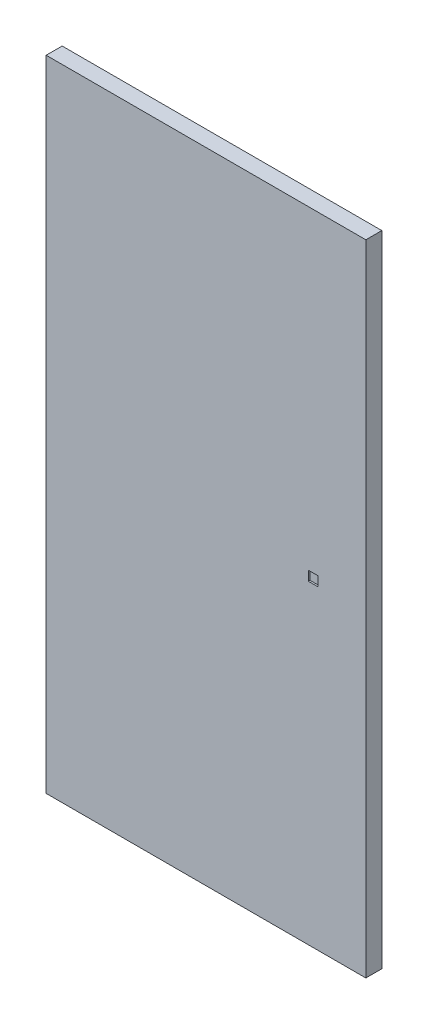
ISO-10303-21;
HEADER;
FILE_DESCRIPTION(('STEP AP214'),'2;1');
FILE_NAME('part.step','',(''),(''),'','','');
FILE_SCHEMA(('AUTOMOTIVE_DESIGN { 1 0 10303 214 1 1 1 1 }'));
ENDSEC;
DATA;
#1=APPLICATION_CONTEXT('core data for automotive mechanical design processes');
#2=APPLICATION_PROTOCOL_DEFINITION('international standard','automotive_design',2000,#1);
#3=PRODUCT_CONTEXT('',#1,'mechanical');
#4=PRODUCT('Part','Part','',(#3));
#5=PRODUCT_RELATED_PRODUCT_CATEGORY('part','',(#4));
#6=PRODUCT_DEFINITION_FORMATION('','',#4);
#7=PRODUCT_DEFINITION_CONTEXT('part definition',#1,'design');
#8=PRODUCT_DEFINITION('design','',#6,#7);
#9=PRODUCT_DEFINITION_SHAPE('','',#8);
#10=(LENGTH_UNIT() NAMED_UNIT(*) SI_UNIT(.MILLI.,.METRE.));
#11=(NAMED_UNIT(*) PLANE_ANGLE_UNIT() SI_UNIT($,.RADIAN.));
#12=(NAMED_UNIT(*) SI_UNIT($,.STERADIAN.) SOLID_ANGLE_UNIT());
#13=UNCERTAINTY_MEASURE_WITH_UNIT(LENGTH_MEASURE(1.E-05),#10,'distance_accuracy_value','');
#14=(GEOMETRIC_REPRESENTATION_CONTEXT(3) GLOBAL_UNCERTAINTY_ASSIGNED_CONTEXT((#13)) GLOBAL_UNIT_ASSIGNED_CONTEXT((#10,
#11,#12)) REPRESENTATION_CONTEXT('',''));
#15=CARTESIAN_POINT('',(0.,0.,0.));
#16=DIRECTION('',(0.,0.,1.));
#17=DIRECTION('',(1.,0.,0.));
#18=AXIS2_PLACEMENT_3D('',#15,#16,#17);
#19=CARTESIAN_POINT('',(0.,0.,0.));
#20=DIRECTION('',(0.,0.,1.));
#21=DIRECTION('',(1.,0.,0.));
#22=AXIS2_PLACEMENT_3D('',#19,#20,#21);
#23=PLANE('',#22);
#24=DIRECTION('',(0.,-1.,0.));
#25=VECTOR('',#24,1.);
#26=CARTESIAN_POINT('',(-500.,-1000.,0.));
#27=LINE('',#26,#25);
#28=CARTESIAN_POINT('',(-500.,1000.,0.));
#29=VERTEX_POINT('',#28);
#30=CARTESIAN_POINT('',(-500.,-1000.,0.));
#31=VERTEX_POINT('',#30);
#32=EDGE_CURVE('E184',#29,#31,#27,.T.);
#33=ORIENTED_EDGE('',*,*,#32,.F.);
#34=DIRECTION('',(-1.,0.,0.));
#35=VECTOR('',#34,1.);
#36=CARTESIAN_POINT('',(500.,1000.,0.));
#37=LINE('',#36,#35);
#38=CARTESIAN_POINT('',(500.,1000.,0.));
#39=VERTEX_POINT('',#38);
#40=EDGE_CURVE('E194',#39,#29,#37,.T.);
#41=ORIENTED_EDGE('',*,*,#40,.F.);
#42=DIRECTION('',(0.,1.,0.));
#43=VECTOR('',#42,1.);
#44=CARTESIAN_POINT('',(500.,-1000.,0.));
#45=LINE('',#44,#43);
#46=CARTESIAN_POINT('',(500.,-1000.,0.));
#47=VERTEX_POINT('',#46);
#48=EDGE_CURVE('E205',#47,#39,#45,.T.);
#49=ORIENTED_EDGE('',*,*,#48,.F.);
#50=DIRECTION('',(1.,0.,0.));
#51=VECTOR('',#50,1.);
#52=CARTESIAN_POINT('',(500.,-1000.,0.));
#53=LINE('',#52,#51);
#54=EDGE_CURVE('E203',#31,#47,#53,.T.);
#55=ORIENTED_EDGE('',*,*,#54,.F.);
#56=EDGE_LOOP('',(#33,#41,#49,#55));
#57=FACE_BOUND('',#56,.T.);
#58=DIRECTION('',(0.,-1.,0.));
#59=VECTOR('',#58,1.);
#60=CARTESIAN_POINT('',(320.,0.,0.));
#61=LINE('',#60,#59);
#62=CARTESIAN_POINT('',(320.,15.,0.));
#63=VERTEX_POINT('',#62);
#64=CARTESIAN_POINT('',(320.,-15.,0.));
#65=VERTEX_POINT('',#64);
#66=EDGE_CURVE('E48',#63,#65,#61,.T.);
#67=ORIENTED_EDGE('',*,*,#66,.T.);
#68=DIRECTION('',(-1.,0.,0.));
#69=VECTOR('',#68,1.);
#70=CARTESIAN_POINT('',(0.,-15.,0.));
#71=LINE('',#70,#69);
#72=CARTESIAN_POINT('',(350.,-15.,0.));
#73=VERTEX_POINT('',#72);
#74=EDGE_CURVE('E142',#73,#65,#71,.T.);
#75=ORIENTED_EDGE('',*,*,#74,.F.);
#76=DIRECTION('',(0.,-1.,0.));
#77=VECTOR('',#76,1.);
#78=CARTESIAN_POINT('',(350.,0.,0.));
#79=LINE('',#78,#77);
#80=CARTESIAN_POINT('',(350.,15.,0.));
#81=VERTEX_POINT('',#80);
#82=EDGE_CURVE('E145',#81,#73,#79,.T.);
#83=ORIENTED_EDGE('',*,*,#82,.F.);
#84=DIRECTION('',(-1.,0.,0.));
#85=VECTOR('',#84,1.);
#86=CARTESIAN_POINT('',(0.,15.,0.));
#87=LINE('',#86,#85);
#88=EDGE_CURVE('E151',#81,#63,#87,.T.);
#89=ORIENTED_EDGE('',*,*,#88,.T.);
#90=EDGE_LOOP('',(#67,#75,#83,#89));
#91=FACE_BOUND('',#90,.T.);
#92=ADVANCED_FACE('F33',(#57,#91),#23,.F.);
#93=CARTESIAN_POINT('',(-500.,-1000.,50.));
#94=DIRECTION('',(1.,0.,0.));
#95=DIRECTION('',(0.,0.,-1.));
#96=AXIS2_PLACEMENT_3D('',#93,#94,#95);
#97=PLANE('',#96);
#98=ORIENTED_EDGE('',*,*,#32,.T.);
#99=DIRECTION('',(0.,0.,-1.));
#100=VECTOR('',#99,1.);
#101=CARTESIAN_POINT('',(-500.,-1000.,50.));
#102=LINE('',#101,#100);
#103=CARTESIAN_POINT('',(-500.,-1000.,50.));
#104=VERTEX_POINT('',#103);
#105=EDGE_CURVE('E11',#104,#31,#102,.T.);
#106=ORIENTED_EDGE('',*,*,#105,.F.);
#107=DIRECTION('',(0.,-1.,0.));
#108=VECTOR('',#107,1.);
#109=CARTESIAN_POINT('',(-500.,-1000.,50.));
#110=LINE('',#109,#108);
#111=CARTESIAN_POINT('',(-500.,1000.,50.));
#112=VERTEX_POINT('',#111);
#113=EDGE_CURVE('E190',#112,#104,#110,.T.);
#114=ORIENTED_EDGE('',*,*,#113,.F.);
#115=DIRECTION('',(0.,0.,-1.));
#116=VECTOR('',#115,1.);
#117=CARTESIAN_POINT('',(-500.,1000.,50.));
#118=LINE('',#117,#116);
#119=EDGE_CURVE('E200',#112,#29,#118,.T.);
#120=ORIENTED_EDGE('',*,*,#119,.T.);
#121=EDGE_LOOP('',(#98,#106,#114,#120));
#122=FACE_BOUND('',#121,.T.);
#123=ADVANCED_FACE('F35',(#122),#97,.F.);
#124=CARTESIAN_POINT('',(500.,-1000.,50.));
#125=DIRECTION('',(0.,1.,0.));
#126=DIRECTION('',(-1.,0.,0.));
#127=AXIS2_PLACEMENT_3D('',#124,#125,#126);
#128=PLANE('',#127);
#129=ORIENTED_EDGE('',*,*,#54,.T.);
#130=DIRECTION('',(0.,0.,-1.));
#131=VECTOR('',#130,1.);
#132=CARTESIAN_POINT('',(500.,-1000.,50.));
#133=LINE('',#132,#131);
#134=CARTESIAN_POINT('',(500.,-1000.,50.));
#135=VERTEX_POINT('',#134);
#136=EDGE_CURVE('E41',#135,#47,#133,.T.);
#137=ORIENTED_EDGE('',*,*,#136,.F.);
#138=DIRECTION('',(1.,0.,0.));
#139=VECTOR('',#138,1.);
#140=CARTESIAN_POINT('',(500.,-1000.,50.));
#141=LINE('',#140,#139);
#142=EDGE_CURVE('E193',#104,#135,#141,.T.);
#143=ORIENTED_EDGE('',*,*,#142,.F.);
#144=ORIENTED_EDGE('',*,*,#105,.T.);
#145=EDGE_LOOP('',(#129,#137,#143,#144));
#146=FACE_BOUND('',#145,.T.);
#147=ADVANCED_FACE('F233',(#146),#128,.F.);
#148=CARTESIAN_POINT('',(500.,-1000.,50.));
#149=DIRECTION('',(-1.,0.,0.));
#150=DIRECTION('',(0.,0.,1.));
#151=AXIS2_PLACEMENT_3D('',#148,#149,#150);
#152=PLANE('',#151);
#153=ORIENTED_EDGE('',*,*,#48,.T.);
#154=DIRECTION('',(0.,0.,-1.));
#155=VECTOR('',#154,1.);
#156=CARTESIAN_POINT('',(500.,1000.,50.));
#157=LINE('',#156,#155);
#158=CARTESIAN_POINT('',(500.,1000.,50.));
#159=VERTEX_POINT('',#158);
#160=EDGE_CURVE('E210',#159,#39,#157,.T.);
#161=ORIENTED_EDGE('',*,*,#160,.F.);
#162=DIRECTION('',(0.,1.,0.));
#163=VECTOR('',#162,1.);
#164=CARTESIAN_POINT('',(500.,-1000.,50.));
#165=LINE('',#164,#163);
#166=EDGE_CURVE('E196',#135,#159,#165,.T.);
#167=ORIENTED_EDGE('',*,*,#166,.F.);
#168=ORIENTED_EDGE('',*,*,#136,.T.);
#169=EDGE_LOOP('',(#153,#161,#167,#168));
#170=FACE_BOUND('',#169,.T.);
#171=ADVANCED_FACE('F217',(#170),#152,.F.);
#172=CARTESIAN_POINT('',(500.,1000.,50.));
#173=DIRECTION('',(0.,-1.,0.));
#174=DIRECTION('',(1.,0.,0.));
#175=AXIS2_PLACEMENT_3D('',#172,#173,#174);
#176=PLANE('',#175);
#177=ORIENTED_EDGE('',*,*,#40,.T.);
#178=ORIENTED_EDGE('',*,*,#119,.F.);
#179=DIRECTION('',(-1.,0.,0.));
#180=VECTOR('',#179,1.);
#181=CARTESIAN_POINT('',(500.,1000.,50.));
#182=LINE('',#181,#180);
#183=EDGE_CURVE('E198',#159,#112,#182,.T.);
#184=ORIENTED_EDGE('',*,*,#183,.F.);
#185=ORIENTED_EDGE('',*,*,#160,.T.);
#186=EDGE_LOOP('',(#177,#178,#184,#185));
#187=FACE_BOUND('',#186,.T.);
#188=ADVANCED_FACE('F226',(#187),#176,.F.);
#189=CARTESIAN_POINT('',(0.,0.,50.));
#190=DIRECTION('',(0.,0.,1.));
#191=DIRECTION('',(1.,0.,0.));
#192=AXIS2_PLACEMENT_3D('',#189,#190,#191);
#193=PLANE('',#192);
#194=DIRECTION('',(-1.,0.,0.));
#195=VECTOR('',#194,1.);
#196=CARTESIAN_POINT('',(0.,14.9999999999999,50.));
#197=LINE('',#196,#195);
#198=CARTESIAN_POINT('',(350.,15.,50.));
#199=VERTEX_POINT('',#198);
#200=CARTESIAN_POINT('',(320.,15.,50.));
#201=VERTEX_POINT('',#200);
#202=EDGE_CURVE('E56',#199,#201,#197,.T.);
#203=ORIENTED_EDGE('',*,*,#202,.F.);
#204=DIRECTION('',(0.,-1.,0.));
#205=VECTOR('',#204,1.);
#206=CARTESIAN_POINT('',(350.,0.,50.));
#207=LINE('',#206,#205);
#208=CARTESIAN_POINT('',(350.,-15.,50.));
#209=VERTEX_POINT('',#208);
#210=EDGE_CURVE('E164',#199,#209,#207,.T.);
#211=ORIENTED_EDGE('',*,*,#210,.T.);
#212=DIRECTION('',(1.,0.,0.));
#213=VECTOR('',#212,1.);
#214=CARTESIAN_POINT('',(0.,-14.9999999999999,50.));
#215=LINE('',#214,#213);
#216=CARTESIAN_POINT('',(320.,-15.,50.));
#217=VERTEX_POINT('',#216);
#218=EDGE_CURVE('E177',#217,#209,#215,.T.);
#219=ORIENTED_EDGE('',*,*,#218,.F.);
#220=DIRECTION('',(0.,-1.,0.));
#221=VECTOR('',#220,1.);
#222=CARTESIAN_POINT('',(320.,0.,50.));
#223=LINE('',#222,#221);
#224=EDGE_CURVE('E174',#201,#217,#223,.T.);
#225=ORIENTED_EDGE('',*,*,#224,.F.);
#226=EDGE_LOOP('',(#203,#211,#219,#225));
#227=FACE_BOUND('',#226,.T.);
#228=ORIENTED_EDGE('',*,*,#113,.T.);
#229=ORIENTED_EDGE('',*,*,#142,.T.);
#230=ORIENTED_EDGE('',*,*,#166,.T.);
#231=ORIENTED_EDGE('',*,*,#183,.T.);
#232=EDGE_LOOP('',(#228,#229,#230,#231));
#233=FACE_BOUND('',#232,.T.);
#234=ADVANCED_FACE('F232',(#227,#233),#193,.T.);
#235=CARTESIAN_POINT('',(0.,14.9999999999999,45.));
#236=DIRECTION('',(0.,1.,0.));
#237=DIRECTION('',(-1.,0.,0.));
#238=AXIS2_PLACEMENT_3D('',#235,#236,#237);
#239=PLANE('',#238);
#240=ORIENTED_EDGE('',*,*,#202,.T.);
#241=DIRECTION('',(0.,0.,1.));
#242=VECTOR('',#241,1.);
#243=CARTESIAN_POINT('',(320.,15.,45.));
#244=LINE('',#243,#242);
#245=CARTESIAN_POINT('',(320.,15.,45.));
#246=VERTEX_POINT('',#245);
#247=EDGE_CURVE('E172',#246,#201,#244,.T.);
#248=ORIENTED_EDGE('',*,*,#247,.F.);
#249=DIRECTION('',(-1.,0.,0.));
#250=VECTOR('',#249,1.);
#251=CARTESIAN_POINT('',(0.,14.9999999999999,45.));
#252=LINE('',#251,#250);
#253=CARTESIAN_POINT('',(350.,15.,45.));
#254=VERTEX_POINT('',#253);
#255=EDGE_CURVE('E160',#254,#246,#252,.T.);
#256=ORIENTED_EDGE('',*,*,#255,.F.);
#257=DIRECTION('',(0.,0.,1.));
#258=VECTOR('',#257,1.);
#259=CARTESIAN_POINT('',(350.,15.,45.));
#260=LINE('',#259,#258);
#261=EDGE_CURVE('E182',#254,#199,#260,.T.);
#262=ORIENTED_EDGE('',*,*,#261,.T.);
#263=EDGE_LOOP('',(#240,#248,#256,#262));
#264=FACE_BOUND('',#263,.T.);
#265=ADVANCED_FACE('F251',(#264),#239,.F.);
#266=CARTESIAN_POINT('',(350.,0.,45.));
#267=DIRECTION('',(-1.,0.,0.));
#268=DIRECTION('',(0.,0.,1.));
#269=AXIS2_PLACEMENT_3D('',#266,#267,#268);
#270=PLANE('',#269);
#271=ORIENTED_EDGE('',*,*,#210,.F.);
#272=ORIENTED_EDGE('',*,*,#261,.F.);
#273=DIRECTION('',(0.,-1.,0.));
#274=VECTOR('',#273,1.);
#275=CARTESIAN_POINT('',(350.,0.,45.));
#276=LINE('',#275,#274);
#277=CARTESIAN_POINT('',(350.,-15.,45.));
#278=VERTEX_POINT('',#277);
#279=EDGE_CURVE('E170',#254,#278,#276,.T.);
#280=ORIENTED_EDGE('',*,*,#279,.T.);
#281=DIRECTION('',(0.,0.,1.));
#282=VECTOR('',#281,1.);
#283=CARTESIAN_POINT('',(350.,-15.,45.));
#284=LINE('',#283,#282);
#285=EDGE_CURVE('E185',#278,#209,#284,.T.);
#286=ORIENTED_EDGE('',*,*,#285,.T.);
#287=EDGE_LOOP('',(#271,#272,#280,#286));
#288=FACE_BOUND('',#287,.T.);
#289=ADVANCED_FACE('F256',(#288),#270,.T.);
#290=CARTESIAN_POINT('',(0.,-14.9999999999999,45.));
#291=DIRECTION('',(0.,-1.,0.));
#292=DIRECTION('',(1.,0.,0.));
#293=AXIS2_PLACEMENT_3D('',#290,#291,#292);
#294=PLANE('',#293);
#295=ORIENTED_EDGE('',*,*,#218,.T.);
#296=ORIENTED_EDGE('',*,*,#285,.F.);
#297=DIRECTION('',(1.,0.,0.));
#298=VECTOR('',#297,1.);
#299=CARTESIAN_POINT('',(0.,-14.9999999999999,45.));
#300=LINE('',#299,#298);
#301=CARTESIAN_POINT('',(320.,-15.,45.));
#302=VERTEX_POINT('',#301);
#303=EDGE_CURVE('E167',#302,#278,#300,.T.);
#304=ORIENTED_EDGE('',*,*,#303,.F.);
#305=DIRECTION('',(0.,0.,1.));
#306=VECTOR('',#305,1.);
#307=CARTESIAN_POINT('',(320.,-15.,45.));
#308=LINE('',#307,#306);
#309=EDGE_CURVE('E187',#302,#217,#308,.T.);
#310=ORIENTED_EDGE('',*,*,#309,.T.);
#311=EDGE_LOOP('',(#295,#296,#304,#310));
#312=FACE_BOUND('',#311,.T.);
#313=ADVANCED_FACE('F271',(#312),#294,.F.);
#314=CARTESIAN_POINT('',(320.,0.,45.));
#315=DIRECTION('',(-1.,0.,0.));
#316=DIRECTION('',(0.,0.,1.));
#317=AXIS2_PLACEMENT_3D('',#314,#315,#316);
#318=PLANE('',#317);
#319=ORIENTED_EDGE('',*,*,#224,.T.);
#320=ORIENTED_EDGE('',*,*,#309,.F.);
#321=DIRECTION('',(0.,-1.,0.));
#322=VECTOR('',#321,1.);
#323=CARTESIAN_POINT('',(320.,0.,45.));
#324=LINE('',#323,#322);
#325=EDGE_CURVE('E163',#246,#302,#324,.T.);
#326=ORIENTED_EDGE('',*,*,#325,.F.);
#327=ORIENTED_EDGE('',*,*,#247,.T.);
#328=EDGE_LOOP('',(#319,#320,#326,#327));
#329=FACE_BOUND('',#328,.T.);
#330=ADVANCED_FACE('F261',(#329),#318,.F.);
#331=CARTESIAN_POINT('',(0.,0.,45.));
#332=DIRECTION('',(0.,0.,1.));
#333=DIRECTION('',(1.,0.,0.));
#334=AXIS2_PLACEMENT_3D('',#331,#332,#333);
#335=PLANE('',#334);
#336=ORIENTED_EDGE('',*,*,#255,.T.);
#337=ORIENTED_EDGE('',*,*,#325,.T.);
#338=ORIENTED_EDGE('',*,*,#303,.T.);
#339=ORIENTED_EDGE('',*,*,#279,.F.);
#340=EDGE_LOOP('',(#336,#337,#338,#339));
#341=FACE_BOUND('',#340,.T.);
#342=ADVANCED_FACE('F267',(#341),#335,.T.);
#343=CARTESIAN_POINT('',(320.,0.,5.));
#344=DIRECTION('',(1.,0.,0.));
#345=DIRECTION('',(0.,0.,-1.));
#346=AXIS2_PLACEMENT_3D('',#343,#344,#345);
#347=PLANE('',#346);
#348=ORIENTED_EDGE('',*,*,#66,.F.);
#349=DIRECTION('',(0.,0.,-1.));
#350=VECTOR('',#349,1.);
#351=CARTESIAN_POINT('',(320.,15.,5.));
#352=LINE('',#351,#350);
#353=CARTESIAN_POINT('',(320.,15.,5.));
#354=VERTEX_POINT('',#353);
#355=EDGE_CURVE('E125',#354,#63,#352,.T.);
#356=ORIENTED_EDGE('',*,*,#355,.F.);
#357=DIRECTION('',(0.,-1.,0.));
#358=VECTOR('',#357,1.);
#359=CARTESIAN_POINT('',(320.,0.,5.));
#360=LINE('',#359,#358);
#361=CARTESIAN_POINT('',(320.,-15.,5.));
#362=VERTEX_POINT('',#361);
#363=EDGE_CURVE('E133',#354,#362,#360,.T.);
#364=ORIENTED_EDGE('',*,*,#363,.T.);
#365=DIRECTION('',(0.,0.,-1.));
#366=VECTOR('',#365,1.);
#367=CARTESIAN_POINT('',(320.,-15.,5.));
#368=LINE('',#367,#366);
#369=EDGE_CURVE('E155',#362,#65,#368,.T.);
#370=ORIENTED_EDGE('',*,*,#369,.T.);
#371=EDGE_LOOP('',(#348,#356,#364,#370));
#372=FACE_BOUND('',#371,.T.);
#373=ADVANCED_FACE('F135',(#372),#347,.T.);
#374=CARTESIAN_POINT('',(0.,-15.,5.));
#375=DIRECTION('',(0.,-1.,0.));
#376=DIRECTION('',(0.,0.,-1.));
#377=AXIS2_PLACEMENT_3D('',#374,#375,#376);
#378=PLANE('',#377);
#379=ORIENTED_EDGE('',*,*,#74,.T.);
#380=ORIENTED_EDGE('',*,*,#369,.F.);
#381=DIRECTION('',(-1.,0.,0.));
#382=VECTOR('',#381,1.);
#383=CARTESIAN_POINT('',(0.,-15.,5.));
#384=LINE('',#383,#382);
#385=CARTESIAN_POINT('',(350.,-15.,5.));
#386=VERTEX_POINT('',#385);
#387=EDGE_CURVE('E137',#386,#362,#384,.T.);
#388=ORIENTED_EDGE('',*,*,#387,.F.);
#389=DIRECTION('',(0.,0.,-1.));
#390=VECTOR('',#389,1.);
#391=CARTESIAN_POINT('',(350.,-15.,5.));
#392=LINE('',#391,#390);
#393=EDGE_CURVE('E157',#386,#73,#392,.T.);
#394=ORIENTED_EDGE('',*,*,#393,.T.);
#395=EDGE_LOOP('',(#379,#380,#388,#394));
#396=FACE_BOUND('',#395,.T.);
#397=ADVANCED_FACE('F285',(#396),#378,.F.);
#398=CARTESIAN_POINT('',(350.,0.,5.));
#399=DIRECTION('',(1.,0.,0.));
#400=DIRECTION('',(0.,0.,-1.));
#401=AXIS2_PLACEMENT_3D('',#398,#399,#400);
#402=PLANE('',#401);
#403=ORIENTED_EDGE('',*,*,#82,.T.);
#404=ORIENTED_EDGE('',*,*,#393,.F.);
#405=DIRECTION('',(0.,-1.,0.));
#406=VECTOR('',#405,1.);
#407=CARTESIAN_POINT('',(350.,0.,5.));
#408=LINE('',#407,#406);
#409=CARTESIAN_POINT('',(350.,15.,5.));
#410=VERTEX_POINT('',#409);
#411=EDGE_CURVE('E132',#410,#386,#408,.T.);
#412=ORIENTED_EDGE('',*,*,#411,.F.);
#413=DIRECTION('',(0.,0.,-1.));
#414=VECTOR('',#413,1.);
#415=CARTESIAN_POINT('',(350.,15.,5.));
#416=LINE('',#415,#414);
#417=EDGE_CURVE('E127',#410,#81,#416,.T.);
#418=ORIENTED_EDGE('',*,*,#417,.T.);
#419=EDGE_LOOP('',(#403,#404,#412,#418));
#420=FACE_BOUND('',#419,.T.);
#421=ADVANCED_FACE('F288',(#420),#402,.F.);
#422=CARTESIAN_POINT('',(0.,15.,5.));
#423=DIRECTION('',(0.,-1.,0.));
#424=DIRECTION('',(0.,0.,-1.));
#425=AXIS2_PLACEMENT_3D('',#422,#423,#424);
#426=PLANE('',#425);
#427=ORIENTED_EDGE('',*,*,#88,.F.);
#428=ORIENTED_EDGE('',*,*,#417,.F.);
#429=DIRECTION('',(-1.,0.,0.));
#430=VECTOR('',#429,1.);
#431=CARTESIAN_POINT('',(0.,15.,5.));
#432=LINE('',#431,#430);
#433=EDGE_CURVE('E122',#410,#354,#432,.T.);
#434=ORIENTED_EDGE('',*,*,#433,.T.);
#435=ORIENTED_EDGE('',*,*,#355,.T.);
#436=EDGE_LOOP('',(#427,#428,#434,#435));
#437=FACE_BOUND('',#436,.T.);
#438=ADVANCED_FACE('F124',(#437),#426,.T.);
#439=CARTESIAN_POINT('',(0.,0.,5.));
#440=DIRECTION('',(0.,0.,-1.));
#441=DIRECTION('',(-1.,0.,0.));
#442=AXIS2_PLACEMENT_3D('',#439,#440,#441);
#443=PLANE('',#442);
#444=ORIENTED_EDGE('',*,*,#363,.F.);
#445=ORIENTED_EDGE('',*,*,#433,.F.);
#446=ORIENTED_EDGE('',*,*,#411,.T.);
#447=ORIENTED_EDGE('',*,*,#387,.T.);
#448=EDGE_LOOP('',(#444,#445,#446,#447));
#449=FACE_BOUND('',#448,.T.);
#450=ADVANCED_FACE('F140',(#449),#443,.T.);
#451=CLOSED_SHELL('',(#92,#123,#147,#171,#188,#234,#265,#289,#313,#330,#342,#373,#397,#421,#438,#450));
#452=MANIFOLD_SOLID_BREP('B2',#451);
#453=ADVANCED_BREP_SHAPE_REPRESENTATION('',(#18,#452),#14);
#454=SHAPE_DEFINITION_REPRESENTATION(#9,#453);
ENDSEC;
END-ISO-10303-21;
